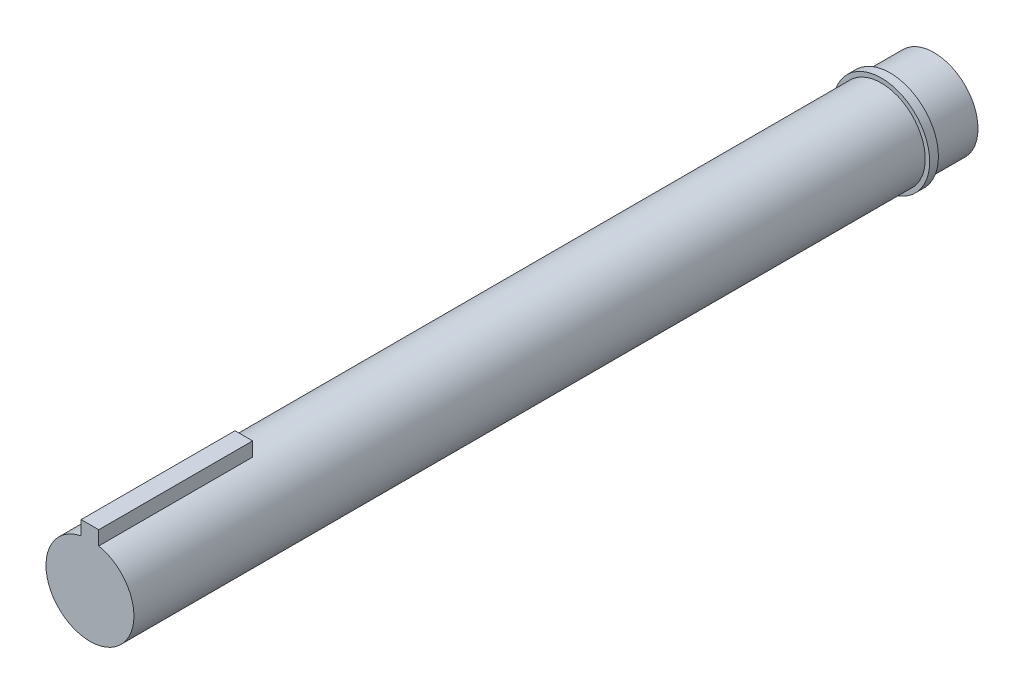
ISO-10303-21;
HEADER;
FILE_DESCRIPTION(('STEP AP214'),'2;1');
FILE_NAME('part.step','',(''),(''),'','','');
FILE_SCHEMA(('AUTOMOTIVE_DESIGN { 1 0 10303 214 1 1 1 1 }'));
ENDSEC;
DATA;
#1=APPLICATION_CONTEXT('core data for automotive mechanical design processes');
#2=APPLICATION_PROTOCOL_DEFINITION('international standard','automotive_design',2000,#1);
#3=PRODUCT_CONTEXT('',#1,'mechanical');
#4=PRODUCT('Part','Part','',(#3));
#5=PRODUCT_RELATED_PRODUCT_CATEGORY('part','',(#4));
#6=PRODUCT_DEFINITION_FORMATION('','',#4);
#7=PRODUCT_DEFINITION_CONTEXT('part definition',#1,'design');
#8=PRODUCT_DEFINITION('design','',#6,#7);
#9=PRODUCT_DEFINITION_SHAPE('','',#8);
#10=(LENGTH_UNIT() NAMED_UNIT(*) SI_UNIT(.MILLI.,.METRE.));
#11=(NAMED_UNIT(*) PLANE_ANGLE_UNIT() SI_UNIT($,.RADIAN.));
#12=(NAMED_UNIT(*) SI_UNIT($,.STERADIAN.) SOLID_ANGLE_UNIT());
#13=UNCERTAINTY_MEASURE_WITH_UNIT(LENGTH_MEASURE(1.E-05),#10,'distance_accuracy_value','');
#14=(GEOMETRIC_REPRESENTATION_CONTEXT(3) GLOBAL_UNCERTAINTY_ASSIGNED_CONTEXT((#13)) GLOBAL_UNIT_ASSIGNED_CONTEXT((#10,
#11,#12)) REPRESENTATION_CONTEXT('',''));
#15=CARTESIAN_POINT('',(0.,0.,0.));
#16=DIRECTION('',(0.,0.,1.));
#17=DIRECTION('',(1.,0.,0.));
#18=AXIS2_PLACEMENT_3D('',#15,#16,#17);
#19=CARTESIAN_POINT('',(0.,0.,12.7));
#20=DIRECTION('',(0.,0.,-1.));
#21=DIRECTION('',(-1.,0.,0.));
#22=AXIS2_PLACEMENT_3D('',#19,#20,#21);
#23=CYLINDRICAL_SURFACE('',#22,12.7);
#24=CARTESIAN_POINT('',(0.,0.,12.7));
#25=DIRECTION('',(0.,0.,1.));
#26=DIRECTION('',(1.,0.,0.));
#27=AXIS2_PLACEMENT_3D('',#24,#25,#26);
#28=CIRCLE('',#27,12.7);
#29=CARTESIAN_POINT('',(12.7,0.,12.7));
#30=VERTEX_POINT('',#29);
#31=EDGE_CURVE('E53',#30,#30,#28,.T.);
#32=ORIENTED_EDGE('',*,*,#31,.F.);
#33=EDGE_LOOP('',(#32));
#34=FACE_BOUND('',#33,.T.);
#35=CARTESIAN_POINT('',(0.,0.,0.));
#36=DIRECTION('',(0.,0.,1.));
#37=DIRECTION('',(1.,0.,0.));
#38=AXIS2_PLACEMENT_3D('',#35,#36,#37);
#39=CIRCLE('',#38,12.7);
#40=CARTESIAN_POINT('',(12.7,0.,0.));
#41=VERTEX_POINT('',#40);
#42=EDGE_CURVE('E48',#41,#41,#39,.T.);
#43=ORIENTED_EDGE('',*,*,#42,.T.);
#44=EDGE_LOOP('',(#43));
#45=FACE_BOUND('',#44,.T.);
#46=ADVANCED_FACE('F45',(#34,#45),#23,.T.);
#47=CARTESIAN_POINT('',(0.,0.,0.));
#48=DIRECTION('',(0.,0.,1.));
#49=DIRECTION('',(1.,0.,0.));
#50=AXIS2_PLACEMENT_3D('',#47,#48,#49);
#51=PLANE('',#50);
#52=ORIENTED_EDGE('',*,*,#42,.F.);
#53=EDGE_LOOP('',(#52));
#54=FACE_BOUND('',#53,.T.);
#55=ADVANCED_FACE('F139',(#54),#51,.F.);
#56=CARTESIAN_POINT('',(0.,0.,15.24));
#57=DIRECTION('',(0.,0.,-1.));
#58=DIRECTION('',(-1.,0.,0.));
#59=AXIS2_PLACEMENT_3D('',#56,#57,#58);
#60=CYLINDRICAL_SURFACE('',#59,13.97);
#61=CARTESIAN_POINT('',(0.,0.,15.24));
#62=DIRECTION('',(0.,0.,1.));
#63=DIRECTION('',(1.,0.,0.));
#64=AXIS2_PLACEMENT_3D('',#61,#62,#63);
#65=CIRCLE('',#64,13.97);
#66=CARTESIAN_POINT('',(13.97,0.,15.24));
#67=VERTEX_POINT('',#66);
#68=EDGE_CURVE('E128',#67,#67,#65,.T.);
#69=ORIENTED_EDGE('',*,*,#68,.F.);
#70=EDGE_LOOP('',(#69));
#71=FACE_BOUND('',#70,.T.);
#72=CARTESIAN_POINT('',(0.,0.,12.7));
#73=DIRECTION('',(0.,0.,1.));
#74=DIRECTION('',(1.,0.,0.));
#75=AXIS2_PLACEMENT_3D('',#72,#73,#74);
#76=CIRCLE('',#75,13.97);
#77=CARTESIAN_POINT('',(13.97,0.,12.7));
#78=VERTEX_POINT('',#77);
#79=EDGE_CURVE('E126',#78,#78,#76,.T.);
#80=ORIENTED_EDGE('',*,*,#79,.T.);
#81=EDGE_LOOP('',(#80));
#82=FACE_BOUND('',#81,.T.);
#83=ADVANCED_FACE('F141',(#71,#82),#60,.T.);
#84=CARTESIAN_POINT('',(0.,0.,15.24));
#85=DIRECTION('',(0.,0.,1.));
#86=DIRECTION('',(1.,0.,0.));
#87=AXIS2_PLACEMENT_3D('',#84,#85,#86);
#88=PLANE('',#87);
#89=CARTESIAN_POINT('',(0.,0.,15.24));
#90=DIRECTION('',(0.,0.,1.));
#91=DIRECTION('',(1.,0.,0.));
#92=AXIS2_PLACEMENT_3D('',#89,#90,#91);
#93=CIRCLE('',#92,12.7);
#94=CARTESIAN_POINT('',(12.7,0.,15.24));
#95=VERTEX_POINT('',#94);
#96=EDGE_CURVE('E13',#95,#95,#93,.T.);
#97=ORIENTED_EDGE('',*,*,#96,.F.);
#98=EDGE_LOOP('',(#97));
#99=FACE_BOUND('',#98,.T.);
#100=ORIENTED_EDGE('',*,*,#68,.T.);
#101=EDGE_LOOP('',(#100));
#102=FACE_BOUND('',#101,.T.);
#103=ADVANCED_FACE('F146',(#99,#102),#88,.T.);
#104=CARTESIAN_POINT('',(0.,0.,12.7));
#105=DIRECTION('',(0.,0.,1.));
#106=DIRECTION('',(1.,0.,0.));
#107=AXIS2_PLACEMENT_3D('',#104,#105,#106);
#108=PLANE('',#107);
#109=ORIENTED_EDGE('',*,*,#31,.T.);
#110=EDGE_LOOP('',(#109));
#111=FACE_BOUND('',#110,.T.);
#112=ORIENTED_EDGE('',*,*,#79,.F.);
#113=EDGE_LOOP('',(#112));
#114=FACE_BOUND('',#113,.T.);
#115=ADVANCED_FACE('F151',(#111,#114),#108,.F.);
#116=CARTESIAN_POINT('',(0.,0.,243.84));
#117=DIRECTION('',(0.,0.,-1.));
#118=DIRECTION('',(-1.,0.,0.));
#119=AXIS2_PLACEMENT_3D('',#116,#117,#118);
#120=CYLINDRICAL_SURFACE('',#119,12.7);
#121=CARTESIAN_POINT('',(0.,0.,243.84));
#122=DIRECTION('',(0.,0.,1.));
#123=DIRECTION('',(1.,0.,0.));
#124=AXIS2_PLACEMENT_3D('',#121,#122,#123);
#125=CIRCLE('',#124,12.7);
#126=CARTESIAN_POINT('',(-2.54,12.4434078933385,243.84));
#127=VERTEX_POINT('',#126);
#128=CARTESIAN_POINT('',(2.54,12.4434078933385,243.84));
#129=VERTEX_POINT('',#128);
#130=EDGE_CURVE('E123',#127,#129,#125,.T.);
#131=ORIENTED_EDGE('',*,*,#130,.F.);
#132=DIRECTION('',(0.,0.,1.));
#133=VECTOR('',#132,1.);
#134=CARTESIAN_POINT('',(-2.54,12.4434078933385,199.39));
#135=LINE('',#134,#133);
#136=CARTESIAN_POINT('',(-2.54,12.4434078933385,199.39));
#137=VERTEX_POINT('',#136);
#138=EDGE_CURVE('E108',#137,#127,#135,.T.);
#139=ORIENTED_EDGE('',*,*,#138,.F.);
#140=CARTESIAN_POINT('',(0.,0.,199.39));
#141=DIRECTION('',(0.,0.,1.));
#142=DIRECTION('',(1.,0.,0.));
#143=AXIS2_PLACEMENT_3D('',#140,#141,#142);
#144=CIRCLE('',#143,12.7);
#145=CARTESIAN_POINT('',(2.54,12.4434078933385,199.39));
#146=VERTEX_POINT('',#145);
#147=EDGE_CURVE('E90',#146,#137,#144,.T.);
#148=ORIENTED_EDGE('',*,*,#147,.F.);
#149=DIRECTION('',(0.,0.,1.));
#150=VECTOR('',#149,1.);
#151=CARTESIAN_POINT('',(2.54,12.4434078933385,199.39));
#152=LINE('',#151,#150);
#153=EDGE_CURVE('E101',#146,#129,#152,.T.);
#154=ORIENTED_EDGE('',*,*,#153,.T.);
#155=EDGE_LOOP('',(#131,#139,#148,#154));
#156=FACE_BOUND('',#155,.T.);
#157=ORIENTED_EDGE('',*,*,#96,.T.);
#158=EDGE_LOOP('',(#157));
#159=FACE_BOUND('',#158,.T.);
#160=ADVANCED_FACE('F111',(#156,#159),#120,.T.);
#161=CARTESIAN_POINT('',(0.,0.,243.84));
#162=DIRECTION('',(0.,0.,1.));
#163=DIRECTION('',(1.,0.,0.));
#164=AXIS2_PLACEMENT_3D('',#161,#162,#163);
#165=PLANE('',#164);
#166=ORIENTED_EDGE('',*,*,#130,.T.);
#167=DIRECTION('',(0.,-1.,0.));
#168=VECTOR('',#167,1.);
#169=CARTESIAN_POINT('',(2.54,16.51,243.84));
#170=LINE('',#169,#168);
#171=CARTESIAN_POINT('',(2.54,16.51,243.84));
#172=VERTEX_POINT('',#171);
#173=EDGE_CURVE('E104',#172,#129,#170,.T.);
#174=ORIENTED_EDGE('',*,*,#173,.F.);
#175=DIRECTION('',(1.,0.,0.));
#176=VECTOR('',#175,1.);
#177=CARTESIAN_POINT('',(-2.54,16.51,243.84));
#178=LINE('',#177,#176);
#179=CARTESIAN_POINT('',(-2.54,16.51,243.84));
#180=VERTEX_POINT('',#179);
#181=EDGE_CURVE('E115',#180,#172,#178,.T.);
#182=ORIENTED_EDGE('',*,*,#181,.F.);
#183=DIRECTION('',(0.,-1.,0.));
#184=VECTOR('',#183,1.);
#185=CARTESIAN_POINT('',(-2.54,16.51,243.84));
#186=LINE('',#185,#184);
#187=EDGE_CURVE('E61',#180,#127,#186,.T.);
#188=ORIENTED_EDGE('',*,*,#187,.T.);
#189=EDGE_LOOP('',(#166,#174,#182,#188));
#190=FACE_BOUND('',#189,.T.);
#191=ADVANCED_FACE('F159',(#190),#165,.T.);
#192=CARTESIAN_POINT('',(-2.54,16.51,199.39));
#193=DIRECTION('',(-1.,0.,0.));
#194=DIRECTION('',(0.,-1.,0.));
#195=AXIS2_PLACEMENT_3D('',#192,#193,#194);
#196=PLANE('',#195);
#197=ORIENTED_EDGE('',*,*,#187,.F.);
#198=DIRECTION('',(0.,0.,1.));
#199=VECTOR('',#198,1.);
#200=CARTESIAN_POINT('',(-2.54,16.51,199.39));
#201=LINE('',#200,#199);
#202=CARTESIAN_POINT('',(-2.54,16.51,199.39));
#203=VERTEX_POINT('',#202);
#204=EDGE_CURVE('E69',#203,#180,#201,.T.);
#205=ORIENTED_EDGE('',*,*,#204,.F.);
#206=DIRECTION('',(0.,-1.,0.));
#207=VECTOR('',#206,1.);
#208=CARTESIAN_POINT('',(-2.54,16.51,199.39));
#209=LINE('',#208,#207);
#210=EDGE_CURVE('E113',#203,#137,#209,.T.);
#211=ORIENTED_EDGE('',*,*,#210,.T.);
#212=ORIENTED_EDGE('',*,*,#138,.T.);
#213=EDGE_LOOP('',(#197,#205,#211,#212));
#214=FACE_BOUND('',#213,.T.);
#215=ADVANCED_FACE('F162',(#214),#196,.T.);
#216=CARTESIAN_POINT('',(-2.54,16.51,199.39));
#217=DIRECTION('',(0.,-1.,0.));
#218=DIRECTION('',(0.,0.,-1.));
#219=AXIS2_PLACEMENT_3D('',#216,#217,#218);
#220=PLANE('',#219);
#221=ORIENTED_EDGE('',*,*,#181,.T.);
#222=DIRECTION('',(0.,0.,1.));
#223=VECTOR('',#222,1.);
#224=CARTESIAN_POINT('',(2.54,16.51,199.39));
#225=LINE('',#224,#223);
#226=CARTESIAN_POINT('',(2.54,16.51,199.39));
#227=VERTEX_POINT('',#226);
#228=EDGE_CURVE('E107',#227,#172,#225,.T.);
#229=ORIENTED_EDGE('',*,*,#228,.F.);
#230=DIRECTION('',(1.,0.,0.));
#231=VECTOR('',#230,1.);
#232=CARTESIAN_POINT('',(-2.54,16.51,199.39));
#233=LINE('',#232,#231);
#234=EDGE_CURVE('E95',#203,#227,#233,.T.);
#235=ORIENTED_EDGE('',*,*,#234,.F.);
#236=ORIENTED_EDGE('',*,*,#204,.T.);
#237=EDGE_LOOP('',(#221,#229,#235,#236));
#238=FACE_BOUND('',#237,.T.);
#239=ADVANCED_FACE('F165',(#238),#220,.F.);
#240=CARTESIAN_POINT('',(2.54,16.51,199.39));
#241=DIRECTION('',(-1.,0.,0.));
#242=DIRECTION('',(0.,-1.,0.));
#243=AXIS2_PLACEMENT_3D('',#240,#241,#242);
#244=PLANE('',#243);
#245=ORIENTED_EDGE('',*,*,#173,.T.);
#246=ORIENTED_EDGE('',*,*,#153,.F.);
#247=DIRECTION('',(0.,-1.,0.));
#248=VECTOR('',#247,1.);
#249=CARTESIAN_POINT('',(2.54,16.51,199.39));
#250=LINE('',#249,#248);
#251=EDGE_CURVE('E92',#227,#146,#250,.T.);
#252=ORIENTED_EDGE('',*,*,#251,.F.);
#253=ORIENTED_EDGE('',*,*,#228,.T.);
#254=EDGE_LOOP('',(#245,#246,#252,#253));
#255=FACE_BOUND('',#254,.T.);
#256=ADVANCED_FACE('F102',(#255),#244,.F.);
#257=CARTESIAN_POINT('',(0.,0.,199.39));
#258=DIRECTION('',(0.,0.,1.));
#259=DIRECTION('',(1.,0.,0.));
#260=AXIS2_PLACEMENT_3D('',#257,#258,#259);
#261=PLANE('',#260);
#262=ORIENTED_EDGE('',*,*,#210,.F.);
#263=ORIENTED_EDGE('',*,*,#234,.T.);
#264=ORIENTED_EDGE('',*,*,#251,.T.);
#265=ORIENTED_EDGE('',*,*,#147,.T.);
#266=EDGE_LOOP('',(#262,#263,#264,#265));
#267=FACE_BOUND('',#266,.T.);
#268=ADVANCED_FACE('F94',(#267),#261,.F.);
#269=CLOSED_SHELL('',(#46,#55,#83,#103,#115,#160,#191,#215,#239,#256,#268));
#270=MANIFOLD_SOLID_BREP('B2',#269);
#271=ADVANCED_BREP_SHAPE_REPRESENTATION('',(#18,#270),#14);
#272=SHAPE_DEFINITION_REPRESENTATION(#9,#271);
ENDSEC;
END-ISO-10303-21;
